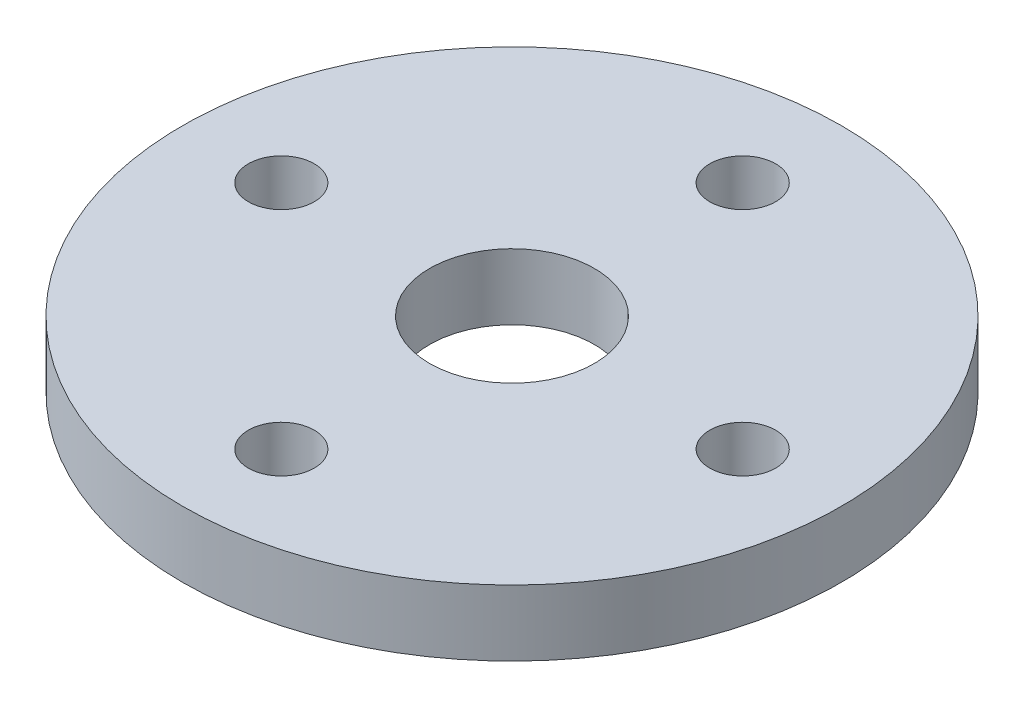
ISO-10303-21;
HEADER;
FILE_DESCRIPTION(('STEP AP214'),'2;1');
FILE_NAME('part.step','',(''),(''),'','','');
FILE_SCHEMA(('AUTOMOTIVE_DESIGN { 1 0 10303 214 1 1 1 1 }'));
ENDSEC;
DATA;
#1=APPLICATION_CONTEXT('core data for automotive mechanical design processes');
#2=APPLICATION_PROTOCOL_DEFINITION('international standard','automotive_design',2000,#1);
#3=PRODUCT_CONTEXT('',#1,'mechanical');
#4=PRODUCT('Part','Part','',(#3));
#5=PRODUCT_RELATED_PRODUCT_CATEGORY('part','',(#4));
#6=PRODUCT_DEFINITION_FORMATION('','',#4);
#7=PRODUCT_DEFINITION_CONTEXT('part definition',#1,'design');
#8=PRODUCT_DEFINITION('design','',#6,#7);
#9=PRODUCT_DEFINITION_SHAPE('','',#8);
#10=(LENGTH_UNIT() NAMED_UNIT(*) SI_UNIT(.MILLI.,.METRE.));
#11=(NAMED_UNIT(*) PLANE_ANGLE_UNIT() SI_UNIT($,.RADIAN.));
#12=(NAMED_UNIT(*) SI_UNIT($,.STERADIAN.) SOLID_ANGLE_UNIT());
#13=UNCERTAINTY_MEASURE_WITH_UNIT(LENGTH_MEASURE(1.E-05),#10,'distance_accuracy_value','');
#14=(GEOMETRIC_REPRESENTATION_CONTEXT(3) GLOBAL_UNCERTAINTY_ASSIGNED_CONTEXT((#13)) GLOBAL_UNIT_ASSIGNED_CONTEXT((#10,
#11,#12)) REPRESENTATION_CONTEXT('',''));
#15=CARTESIAN_POINT('',(0.,0.,0.));
#16=DIRECTION('',(0.,0.,1.));
#17=DIRECTION('',(1.,0.,0.));
#18=AXIS2_PLACEMENT_3D('',#15,#16,#17);
#19=CARTESIAN_POINT('',(0.,2.,0.));
#20=DIRECTION('',(0.,-1.,0.));
#21=DIRECTION('',(0.,0.,-1.));
#22=AXIS2_PLACEMENT_3D('',#19,#20,#21);
#23=CYLINDRICAL_SURFACE('',#22,10.);
#24=CARTESIAN_POINT('',(0.,2.,0.));
#25=DIRECTION('',(0.,1.,0.));
#26=DIRECTION('',(0.,0.,1.));
#27=AXIS2_PLACEMENT_3D('',#24,#25,#26);
#28=CIRCLE('',#27,10.);
#29=CARTESIAN_POINT('',(0.,2.,10.));
#30=VERTEX_POINT('',#29);
#31=EDGE_CURVE('E10',#30,#30,#28,.T.);
#32=ORIENTED_EDGE('',*,*,#31,.F.);
#33=EDGE_LOOP('',(#32));
#34=FACE_BOUND('',#33,.T.);
#35=CARTESIAN_POINT('',(0.,0.,0.));
#36=DIRECTION('',(0.,1.,0.));
#37=DIRECTION('',(0.,0.,1.));
#38=AXIS2_PLACEMENT_3D('',#35,#36,#37);
#39=CIRCLE('',#38,10.);
#40=CARTESIAN_POINT('',(0.,0.,10.));
#41=VERTEX_POINT('',#40);
#42=EDGE_CURVE('E33',#41,#41,#39,.T.);
#43=ORIENTED_EDGE('',*,*,#42,.T.);
#44=EDGE_LOOP('',(#43));
#45=FACE_BOUND('',#44,.T.);
#46=ADVANCED_FACE('F30',(#34,#45),#23,.T.);
#47=CARTESIAN_POINT('',(0.,2.,0.));
#48=DIRECTION('',(0.,1.,0.));
#49=DIRECTION('',(0.,0.,1.));
#50=AXIS2_PLACEMENT_3D('',#47,#48,#49);
#51=PLANE('',#50);
#52=CARTESIAN_POINT('',(0.,2.,-7.));
#53=DIRECTION('',(0.,1.,0.));
#54=DIRECTION('',(0.,0.,1.));
#55=AXIS2_PLACEMENT_3D('',#52,#53,#54);
#56=CIRCLE('',#55,1.);
#57=CARTESIAN_POINT('',(0.,2.,-6.));
#58=VERTEX_POINT('',#57);
#59=EDGE_CURVE('E66',#58,#58,#56,.T.);
#60=ORIENTED_EDGE('',*,*,#59,.F.);
#61=EDGE_LOOP('',(#60));
#62=FACE_BOUND('',#61,.T.);
#63=CARTESIAN_POINT('',(-7.,2.,0.));
#64=DIRECTION('',(0.,1.,0.));
#65=DIRECTION('',(0.,0.,1.));
#66=AXIS2_PLACEMENT_3D('',#63,#64,#65);
#67=CIRCLE('',#66,1.);
#68=CARTESIAN_POINT('',(-7.,2.,0.999999999999951));
#69=VERTEX_POINT('',#68);
#70=EDGE_CURVE('E60',#69,#69,#67,.T.);
#71=ORIENTED_EDGE('',*,*,#70,.F.);
#72=EDGE_LOOP('',(#71));
#73=FACE_BOUND('',#72,.T.);
#74=CARTESIAN_POINT('',(0.,2.,7.));
#75=DIRECTION('',(0.,1.,0.));
#76=DIRECTION('',(0.,0.,1.));
#77=AXIS2_PLACEMENT_3D('',#74,#75,#76);
#78=CIRCLE('',#77,1.);
#79=CARTESIAN_POINT('',(0.,2.,8.));
#80=VERTEX_POINT('',#79);
#81=EDGE_CURVE('E54',#80,#80,#78,.T.);
#82=ORIENTED_EDGE('',*,*,#81,.F.);
#83=EDGE_LOOP('',(#82));
#84=FACE_BOUND('',#83,.T.);
#85=CARTESIAN_POINT('',(7.,2.,0.));
#86=DIRECTION('',(0.,1.,0.));
#87=DIRECTION('',(0.,0.,1.));
#88=AXIS2_PLACEMENT_3D('',#85,#86,#87);
#89=CIRCLE('',#88,1.);
#90=CARTESIAN_POINT('',(7.,2.,1.));
#91=VERTEX_POINT('',#90);
#92=EDGE_CURVE('E48',#91,#91,#89,.T.);
#93=ORIENTED_EDGE('',*,*,#92,.F.);
#94=EDGE_LOOP('',(#93));
#95=FACE_BOUND('',#94,.T.);
#96=CARTESIAN_POINT('',(0.,2.,0.));
#97=DIRECTION('',(0.,1.,0.));
#98=DIRECTION('',(0.,0.,1.));
#99=AXIS2_PLACEMENT_3D('',#96,#97,#98);
#100=CIRCLE('',#99,2.5);
#101=CARTESIAN_POINT('',(0.,2.,2.5));
#102=VERTEX_POINT('',#101);
#103=EDGE_CURVE('E42',#102,#102,#100,.T.);
#104=ORIENTED_EDGE('',*,*,#103,.F.);
#105=EDGE_LOOP('',(#104));
#106=FACE_BOUND('',#105,.T.);
#107=ORIENTED_EDGE('',*,*,#31,.T.);
#108=EDGE_LOOP('',(#107));
#109=FACE_BOUND('',#108,.T.);
#110=ADVANCED_FACE('F82',(#62,#73,#84,#95,#106,#109),#51,.T.);
#111=CARTESIAN_POINT('',(0.,0.,0.));
#112=DIRECTION('',(0.,1.,0.));
#113=DIRECTION('',(0.,0.,1.));
#114=AXIS2_PLACEMENT_3D('',#111,#112,#113);
#115=PLANE('',#114);
#116=CARTESIAN_POINT('',(0.,0.,-7.));
#117=DIRECTION('',(0.,1.,0.));
#118=DIRECTION('',(0.,0.,1.));
#119=AXIS2_PLACEMENT_3D('',#116,#117,#118);
#120=CIRCLE('',#119,1.);
#121=CARTESIAN_POINT('',(0.,0.,-6.));
#122=VERTEX_POINT('',#121);
#123=EDGE_CURVE('E63',#122,#122,#120,.T.);
#124=ORIENTED_EDGE('',*,*,#123,.T.);
#125=EDGE_LOOP('',(#124));
#126=FACE_BOUND('',#125,.T.);
#127=CARTESIAN_POINT('',(-7.,0.,0.));
#128=DIRECTION('',(0.,1.,0.));
#129=DIRECTION('',(0.,0.,1.));
#130=AXIS2_PLACEMENT_3D('',#127,#128,#129);
#131=CIRCLE('',#130,1.);
#132=CARTESIAN_POINT('',(-7.,0.,0.999999999999951));
#133=VERTEX_POINT('',#132);
#134=EDGE_CURVE('E57',#133,#133,#131,.T.);
#135=ORIENTED_EDGE('',*,*,#134,.T.);
#136=EDGE_LOOP('',(#135));
#137=FACE_BOUND('',#136,.T.);
#138=CARTESIAN_POINT('',(0.,0.,7.));
#139=DIRECTION('',(0.,1.,0.));
#140=DIRECTION('',(0.,0.,1.));
#141=AXIS2_PLACEMENT_3D('',#138,#139,#140);
#142=CIRCLE('',#141,1.);
#143=CARTESIAN_POINT('',(0.,0.,8.));
#144=VERTEX_POINT('',#143);
#145=EDGE_CURVE('E51',#144,#144,#142,.T.);
#146=ORIENTED_EDGE('',*,*,#145,.T.);
#147=EDGE_LOOP('',(#146));
#148=FACE_BOUND('',#147,.T.);
#149=CARTESIAN_POINT('',(7.,0.,0.));
#150=DIRECTION('',(0.,1.,0.));
#151=DIRECTION('',(0.,0.,1.));
#152=AXIS2_PLACEMENT_3D('',#149,#150,#151);
#153=CIRCLE('',#152,1.);
#154=CARTESIAN_POINT('',(7.,0.,1.));
#155=VERTEX_POINT('',#154);
#156=EDGE_CURVE('E45',#155,#155,#153,.T.);
#157=ORIENTED_EDGE('',*,*,#156,.T.);
#158=EDGE_LOOP('',(#157));
#159=FACE_BOUND('',#158,.T.);
#160=CARTESIAN_POINT('',(0.,0.,0.));
#161=DIRECTION('',(0.,1.,0.));
#162=DIRECTION('',(0.,0.,1.));
#163=AXIS2_PLACEMENT_3D('',#160,#161,#162);
#164=CIRCLE('',#163,2.5);
#165=CARTESIAN_POINT('',(0.,0.,2.5));
#166=VERTEX_POINT('',#165);
#167=EDGE_CURVE('E40',#166,#166,#164,.T.);
#168=ORIENTED_EDGE('',*,*,#167,.T.);
#169=EDGE_LOOP('',(#168));
#170=FACE_BOUND('',#169,.T.);
#171=ORIENTED_EDGE('',*,*,#42,.F.);
#172=EDGE_LOOP('',(#171));
#173=FACE_BOUND('',#172,.T.);
#174=ADVANCED_FACE('F72',(#126,#137,#148,#159,#170,#173),#115,.F.);
#175=CARTESIAN_POINT('',(0.,0.,0.));
#176=DIRECTION('',(0.,1.,0.));
#177=DIRECTION('',(0.,0.,1.));
#178=AXIS2_PLACEMENT_3D('',#175,#176,#177);
#179=CYLINDRICAL_SURFACE('',#178,2.5);
#180=ORIENTED_EDGE('',*,*,#167,.F.);
#181=EDGE_LOOP('',(#180));
#182=FACE_BOUND('',#181,.T.);
#183=ORIENTED_EDGE('',*,*,#103,.T.);
#184=EDGE_LOOP('',(#183));
#185=FACE_BOUND('',#184,.T.);
#186=ADVANCED_FACE('F94',(#182,#185),#179,.F.);
#187=CARTESIAN_POINT('',(7.,0.,0.));
#188=DIRECTION('',(0.,1.,0.));
#189=DIRECTION('',(0.,0.,1.));
#190=AXIS2_PLACEMENT_3D('',#187,#188,#189);
#191=CYLINDRICAL_SURFACE('',#190,1.);
#192=ORIENTED_EDGE('',*,*,#156,.F.);
#193=EDGE_LOOP('',(#192));
#194=FACE_BOUND('',#193,.T.);
#195=ORIENTED_EDGE('',*,*,#92,.T.);
#196=EDGE_LOOP('',(#195));
#197=FACE_BOUND('',#196,.T.);
#198=ADVANCED_FACE('F96',(#194,#197),#191,.F.);
#199=CARTESIAN_POINT('',(0.,0.,7.));
#200=DIRECTION('',(0.,1.,0.));
#201=DIRECTION('',(0.,0.,1.));
#202=AXIS2_PLACEMENT_3D('',#199,#200,#201);
#203=CYLINDRICAL_SURFACE('',#202,1.);
#204=ORIENTED_EDGE('',*,*,#145,.F.);
#205=EDGE_LOOP('',(#204));
#206=FACE_BOUND('',#205,.T.);
#207=ORIENTED_EDGE('',*,*,#81,.T.);
#208=EDGE_LOOP('',(#207));
#209=FACE_BOUND('',#208,.T.);
#210=ADVANCED_FACE('F103',(#206,#209),#203,.F.);
#211=CARTESIAN_POINT('',(-7.,0.,0.));
#212=DIRECTION('',(0.,1.,0.));
#213=DIRECTION('',(0.,0.,1.));
#214=AXIS2_PLACEMENT_3D('',#211,#212,#213);
#215=CYLINDRICAL_SURFACE('',#214,1.);
#216=ORIENTED_EDGE('',*,*,#134,.F.);
#217=EDGE_LOOP('',(#216));
#218=FACE_BOUND('',#217,.T.);
#219=ORIENTED_EDGE('',*,*,#70,.T.);
#220=EDGE_LOOP('',(#219));
#221=FACE_BOUND('',#220,.T.);
#222=ADVANCED_FACE('F78',(#218,#221),#215,.F.);
#223=CARTESIAN_POINT('',(0.,0.,-7.));
#224=DIRECTION('',(0.,1.,0.));
#225=DIRECTION('',(0.,0.,1.));
#226=AXIS2_PLACEMENT_3D('',#223,#224,#225);
#227=CYLINDRICAL_SURFACE('',#226,1.);
#228=ORIENTED_EDGE('',*,*,#123,.F.);
#229=EDGE_LOOP('',(#228));
#230=FACE_BOUND('',#229,.T.);
#231=ORIENTED_EDGE('',*,*,#59,.T.);
#232=EDGE_LOOP('',(#231));
#233=FACE_BOUND('',#232,.T.);
#234=ADVANCED_FACE('F75',(#230,#233),#227,.F.);
#235=CLOSED_SHELL('',(#46,#110,#174,#186,#198,#210,#222,#234));
#236=MANIFOLD_SOLID_BREP('B2',#235);
#237=ADVANCED_BREP_SHAPE_REPRESENTATION('',(#18,#236),#14);
#238=SHAPE_DEFINITION_REPRESENTATION(#9,#237);
ENDSEC;
END-ISO-10303-21;
